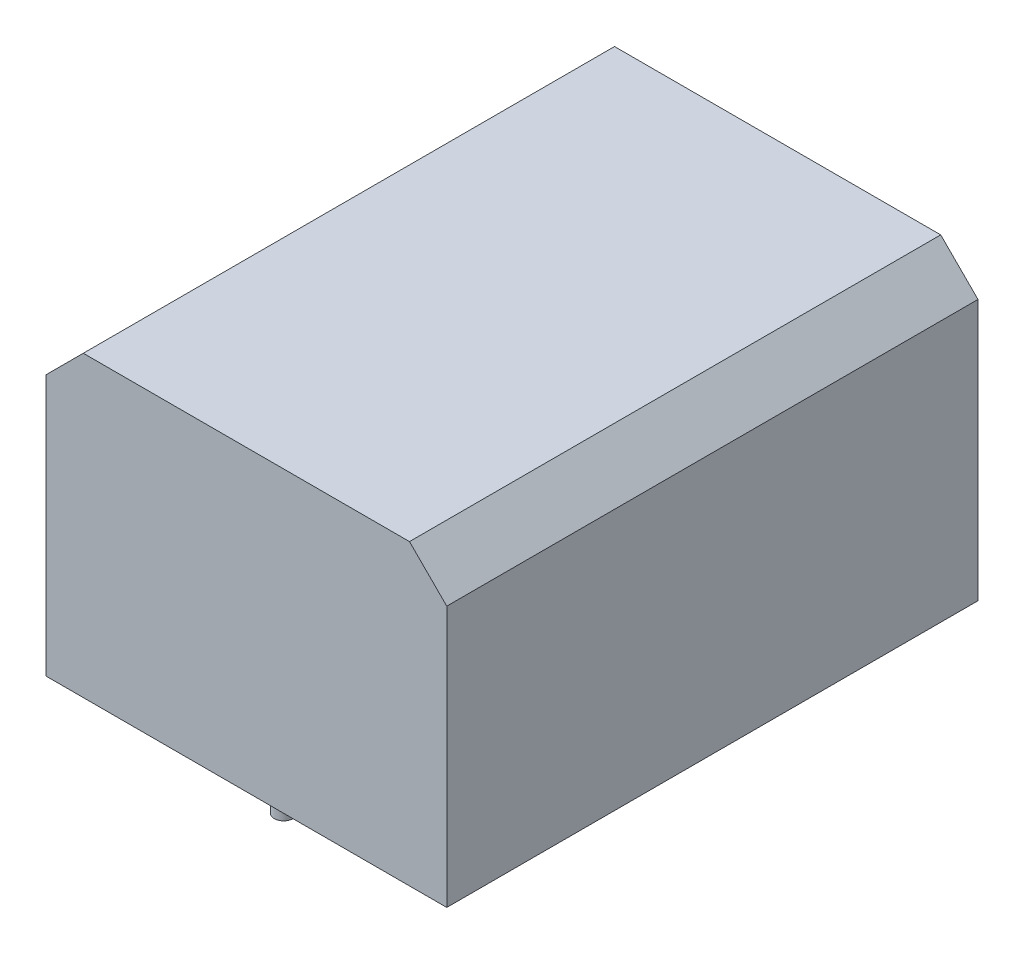
ISO-10303-21;
HEADER;
FILE_DESCRIPTION(('STEP AP214'),'2;1');
FILE_NAME('part.step','',(''),(''),'','','');
FILE_SCHEMA(('AUTOMOTIVE_DESIGN { 1 0 10303 214 1 1 1 1 }'));
ENDSEC;
DATA;
#1=APPLICATION_CONTEXT('core data for automotive mechanical design processes');
#2=APPLICATION_PROTOCOL_DEFINITION('international standard','automotive_design',2000,#1);
#3=PRODUCT_CONTEXT('',#1,'mechanical');
#4=PRODUCT('Part','Part','',(#3));
#5=PRODUCT_RELATED_PRODUCT_CATEGORY('part','',(#4));
#6=PRODUCT_DEFINITION_FORMATION('','',#4);
#7=PRODUCT_DEFINITION_CONTEXT('part definition',#1,'design');
#8=PRODUCT_DEFINITION('design','',#6,#7);
#9=PRODUCT_DEFINITION_SHAPE('','',#8);
#10=(LENGTH_UNIT() NAMED_UNIT(*) SI_UNIT(.MILLI.,.METRE.));
#11=(NAMED_UNIT(*) PLANE_ANGLE_UNIT() SI_UNIT($,.RADIAN.));
#12=(NAMED_UNIT(*) SI_UNIT($,.STERADIAN.) SOLID_ANGLE_UNIT());
#13=UNCERTAINTY_MEASURE_WITH_UNIT(LENGTH_MEASURE(1.E-05),#10,'distance_accuracy_value','');
#14=(GEOMETRIC_REPRESENTATION_CONTEXT(3) GLOBAL_UNCERTAINTY_ASSIGNED_CONTEXT((#13)) GLOBAL_UNIT_ASSIGNED_CONTEXT((#10,
#11,#12)) REPRESENTATION_CONTEXT('',''));
#15=CARTESIAN_POINT('',(0.,0.,0.));
#16=DIRECTION('',(0.,0.,1.));
#17=DIRECTION('',(1.,0.,0.));
#18=AXIS2_PLACEMENT_3D('',#15,#16,#17);
#19=CARTESIAN_POINT('',(-10.75,14.,14.25));
#20=DIRECTION('',(1.,0.,0.));
#21=DIRECTION('',(0.,1.,0.));
#22=AXIS2_PLACEMENT_3D('',#19,#20,#21);
#23=PLANE('',#22);
#24=DIRECTION('',(0.,-1.,0.));
#25=VECTOR('',#24,1.);
#26=CARTESIAN_POINT('',(-10.75,14.,-14.25));
#27=LINE('',#26,#25);
#28=CARTESIAN_POINT('',(-10.75,14.,-14.25));
#29=VERTEX_POINT('',#28);
#30=CARTESIAN_POINT('',(-10.75,0.,-14.25));
#31=VERTEX_POINT('',#30);
#32=EDGE_CURVE('E133',#29,#31,#27,.T.);
#33=ORIENTED_EDGE('',*,*,#32,.T.);
#34=DIRECTION('',(0.,0.,-1.));
#35=VECTOR('',#34,1.);
#36=CARTESIAN_POINT('',(-10.75,0.,14.25));
#37=LINE('',#36,#35);
#38=CARTESIAN_POINT('',(-10.75,0.,14.25));
#39=VERTEX_POINT('',#38);
#40=EDGE_CURVE('E160',#39,#31,#37,.T.);
#41=ORIENTED_EDGE('',*,*,#40,.F.);
#42=DIRECTION('',(0.,-1.,0.));
#43=VECTOR('',#42,1.);
#44=CARTESIAN_POINT('',(-10.75,14.,14.25));
#45=LINE('',#44,#43);
#46=CARTESIAN_POINT('',(-10.75,14.,14.25));
#47=VERTEX_POINT('',#46);
#48=EDGE_CURVE('E149',#47,#39,#45,.T.);
#49=ORIENTED_EDGE('',*,*,#48,.F.);
#50=DIRECTION('',(0.,0.,-1.));
#51=VECTOR('',#50,1.);
#52=CARTESIAN_POINT('',(-10.75,14.,14.25));
#53=LINE('',#52,#51);
#54=EDGE_CURVE('E129',#47,#29,#53,.T.);
#55=ORIENTED_EDGE('',*,*,#54,.T.);
#56=EDGE_LOOP('',(#33,#41,#49,#55));
#57=FACE_BOUND('',#56,.T.);
#58=ADVANCED_FACE('F41',(#57),#23,.F.);
#59=CARTESIAN_POINT('',(-10.75,0.,14.25));
#60=DIRECTION('',(0.,1.,0.));
#61=DIRECTION('',(0.,0.,1.));
#62=AXIS2_PLACEMENT_3D('',#59,#60,#61);
#63=PLANE('',#62);
#64=CARTESIAN_POINT('',(0.,0.,-12.25));
#65=DIRECTION('',(0.,1.,0.));
#66=DIRECTION('',(0.,0.,1.));
#67=AXIS2_PLACEMENT_3D('',#64,#65,#66);
#68=CIRCLE('',#67,0.5);
#69=CARTESIAN_POINT('',(0.,0.,-11.75));
#70=VERTEX_POINT('',#69);
#71=EDGE_CURVE('E11',#70,#70,#68,.F.);
#72=ORIENTED_EDGE('',*,*,#71,.F.);
#73=EDGE_LOOP('',(#72));
#74=FACE_BOUND('',#73,.T.);
#75=CARTESIAN_POINT('',(0.,0.,12.25));
#76=DIRECTION('',(0.,1.,0.));
#77=DIRECTION('',(0.,0.,1.));
#78=AXIS2_PLACEMENT_3D('',#75,#76,#77);
#79=CIRCLE('',#78,0.5);
#80=CARTESIAN_POINT('',(0.,0.,12.75));
#81=VERTEX_POINT('',#80);
#82=EDGE_CURVE('E50',#81,#81,#79,.F.);
#83=ORIENTED_EDGE('',*,*,#82,.F.);
#84=EDGE_LOOP('',(#83));
#85=FACE_BOUND('',#84,.T.);
#86=DIRECTION('',(1.,0.,0.));
#87=VECTOR('',#86,1.);
#88=CARTESIAN_POINT('',(-10.75,0.,-14.25));
#89=LINE('',#88,#87);
#90=CARTESIAN_POINT('',(10.75,0.,-14.25));
#91=VERTEX_POINT('',#90);
#92=EDGE_CURVE('E137',#31,#91,#89,.T.);
#93=ORIENTED_EDGE('',*,*,#92,.T.);
#94=DIRECTION('',(0.,0.,-1.));
#95=VECTOR('',#94,1.);
#96=CARTESIAN_POINT('',(10.75,0.,14.25));
#97=LINE('',#96,#95);
#98=CARTESIAN_POINT('',(10.75,0.,14.25));
#99=VERTEX_POINT('',#98);
#100=EDGE_CURVE('E156',#99,#91,#97,.T.);
#101=ORIENTED_EDGE('',*,*,#100,.F.);
#102=DIRECTION('',(1.,0.,0.));
#103=VECTOR('',#102,1.);
#104=CARTESIAN_POINT('',(-10.75,0.,14.25));
#105=LINE('',#104,#103);
#106=EDGE_CURVE('E96',#39,#99,#105,.T.);
#107=ORIENTED_EDGE('',*,*,#106,.F.);
#108=ORIENTED_EDGE('',*,*,#40,.T.);
#109=EDGE_LOOP('',(#93,#101,#107,#108));
#110=FACE_BOUND('',#109,.T.);
#111=ADVANCED_FACE('F170',(#74,#85,#110),#63,.F.);
#112=CARTESIAN_POINT('',(10.75,0.,14.25));
#113=DIRECTION('',(-1.,0.,0.));
#114=DIRECTION('',(0.,0.,1.));
#115=AXIS2_PLACEMENT_3D('',#112,#113,#114);
#116=PLANE('',#115);
#117=DIRECTION('',(0.,1.,0.));
#118=VECTOR('',#117,1.);
#119=CARTESIAN_POINT('',(10.75,0.,-14.25));
#120=LINE('',#119,#118);
#121=CARTESIAN_POINT('',(10.75,14.,-14.25));
#122=VERTEX_POINT('',#121);
#123=EDGE_CURVE('E140',#91,#122,#120,.T.);
#124=ORIENTED_EDGE('',*,*,#123,.T.);
#125=DIRECTION('',(0.,0.,-1.));
#126=VECTOR('',#125,1.);
#127=CARTESIAN_POINT('',(10.75,14.,14.25));
#128=LINE('',#127,#126);
#129=CARTESIAN_POINT('',(10.75,14.,14.25));
#130=VERTEX_POINT('',#129);
#131=EDGE_CURVE('E120',#130,#122,#128,.T.);
#132=ORIENTED_EDGE('',*,*,#131,.F.);
#133=DIRECTION('',(0.,1.,0.));
#134=VECTOR('',#133,1.);
#135=CARTESIAN_POINT('',(10.75,0.,14.25));
#136=LINE('',#135,#134);
#137=EDGE_CURVE('E109',#99,#130,#136,.T.);
#138=ORIENTED_EDGE('',*,*,#137,.F.);
#139=ORIENTED_EDGE('',*,*,#100,.T.);
#140=EDGE_LOOP('',(#124,#132,#138,#139));
#141=FACE_BOUND('',#140,.T.);
#142=ADVANCED_FACE('F172',(#141),#116,.F.);
#143=CARTESIAN_POINT('',(10.75,14.,14.25));
#144=DIRECTION('',(-0.707106781186547,-0.707106781186547,0.));
#145=DIRECTION('',(0.707106781186548,-0.707106781186548,0.));
#146=AXIS2_PLACEMENT_3D('',#143,#144,#145);
#147=PLANE('',#146);
#148=DIRECTION('',(-0.707106781186548,0.707106781186548,0.));
#149=VECTOR('',#148,1.);
#150=CARTESIAN_POINT('',(10.75,14.,-14.25));
#151=LINE('',#150,#149);
#152=CARTESIAN_POINT('',(8.75,16.,-14.25));
#153=VERTEX_POINT('',#152);
#154=EDGE_CURVE('E118',#122,#153,#151,.T.);
#155=ORIENTED_EDGE('',*,*,#154,.T.);
#156=DIRECTION('',(0.,0.,-1.));
#157=VECTOR('',#156,1.);
#158=CARTESIAN_POINT('',(8.75,16.,14.25));
#159=LINE('',#158,#157);
#160=CARTESIAN_POINT('',(8.75,16.,14.25));
#161=VERTEX_POINT('',#160);
#162=EDGE_CURVE('E115',#161,#153,#159,.T.);
#163=ORIENTED_EDGE('',*,*,#162,.F.);
#164=DIRECTION('',(-0.707106781186548,0.707106781186548,0.));
#165=VECTOR('',#164,1.);
#166=CARTESIAN_POINT('',(10.75,14.,14.25));
#167=LINE('',#166,#165);
#168=EDGE_CURVE('E103',#130,#161,#167,.T.);
#169=ORIENTED_EDGE('',*,*,#168,.F.);
#170=ORIENTED_EDGE('',*,*,#131,.T.);
#171=EDGE_LOOP('',(#155,#163,#169,#170));
#172=FACE_BOUND('',#171,.T.);
#173=ADVANCED_FACE('F116',(#172),#147,.F.);
#174=CARTESIAN_POINT('',(8.75,16.,14.25));
#175=DIRECTION('',(0.,-1.,0.));
#176=DIRECTION('',(1.,0.,0.));
#177=AXIS2_PLACEMENT_3D('',#174,#175,#176);
#178=PLANE('',#177);
#179=DIRECTION('',(-1.,0.,0.));
#180=VECTOR('',#179,1.);
#181=CARTESIAN_POINT('',(8.75,16.,-14.25));
#182=LINE('',#181,#180);
#183=CARTESIAN_POINT('',(-8.75,16.,-14.25));
#184=VERTEX_POINT('',#183);
#185=EDGE_CURVE('E81',#153,#184,#182,.T.);
#186=ORIENTED_EDGE('',*,*,#185,.T.);
#187=DIRECTION('',(0.,0.,-1.));
#188=VECTOR('',#187,1.);
#189=CARTESIAN_POINT('',(-8.75,16.,14.25));
#190=LINE('',#189,#188);
#191=CARTESIAN_POINT('',(-8.75,16.,14.25));
#192=VERTEX_POINT('',#191);
#193=EDGE_CURVE('E121',#192,#184,#190,.T.);
#194=ORIENTED_EDGE('',*,*,#193,.F.);
#195=DIRECTION('',(-1.,0.,0.));
#196=VECTOR('',#195,1.);
#197=CARTESIAN_POINT('',(8.75,16.,14.25));
#198=LINE('',#197,#196);
#199=EDGE_CURVE('E107',#161,#192,#198,.T.);
#200=ORIENTED_EDGE('',*,*,#199,.F.);
#201=ORIENTED_EDGE('',*,*,#162,.T.);
#202=EDGE_LOOP('',(#186,#194,#200,#201));
#203=FACE_BOUND('',#202,.T.);
#204=ADVANCED_FACE('F123',(#203),#178,.F.);
#205=CARTESIAN_POINT('',(-8.75,16.,14.25));
#206=DIRECTION('',(0.707106781186546,-0.707106781186548,0.));
#207=DIRECTION('',(0.707106781186548,0.707106781186547,0.));
#208=AXIS2_PLACEMENT_3D('',#205,#206,#207);
#209=PLANE('',#208);
#210=DIRECTION('',(-0.707106781186548,-0.707106781186547,0.));
#211=VECTOR('',#210,1.);
#212=CARTESIAN_POINT('',(-8.75,16.,-14.25));
#213=LINE('',#212,#211);
#214=EDGE_CURVE('E87',#184,#29,#213,.T.);
#215=ORIENTED_EDGE('',*,*,#214,.T.);
#216=ORIENTED_EDGE('',*,*,#54,.F.);
#217=DIRECTION('',(-0.707106781186548,-0.707106781186547,0.));
#218=VECTOR('',#217,1.);
#219=CARTESIAN_POINT('',(-8.75,16.,14.25));
#220=LINE('',#219,#218);
#221=EDGE_CURVE('E58',#192,#47,#220,.T.);
#222=ORIENTED_EDGE('',*,*,#221,.F.);
#223=ORIENTED_EDGE('',*,*,#193,.T.);
#224=EDGE_LOOP('',(#215,#216,#222,#223));
#225=FACE_BOUND('',#224,.T.);
#226=ADVANCED_FACE('F182',(#225),#209,.F.);
#227=CARTESIAN_POINT('',(0.,0.,14.25));
#228=DIRECTION('',(0.,0.,1.));
#229=DIRECTION('',(1.,0.,0.));
#230=AXIS2_PLACEMENT_3D('',#227,#228,#229);
#231=PLANE('',#230);
#232=ORIENTED_EDGE('',*,*,#48,.T.);
#233=ORIENTED_EDGE('',*,*,#106,.T.);
#234=ORIENTED_EDGE('',*,*,#137,.T.);
#235=ORIENTED_EDGE('',*,*,#168,.T.);
#236=ORIENTED_EDGE('',*,*,#199,.T.);
#237=ORIENTED_EDGE('',*,*,#221,.T.);
#238=EDGE_LOOP('',(#232,#233,#234,#235,#236,#237));
#239=FACE_BOUND('',#238,.T.);
#240=ADVANCED_FACE('F105',(#239),#231,.T.);
#241=CARTESIAN_POINT('',(0.,0.,-14.25));
#242=DIRECTION('',(0.,0.,1.));
#243=DIRECTION('',(1.,0.,0.));
#244=AXIS2_PLACEMENT_3D('',#241,#242,#243);
#245=PLANE('',#244);
#246=ORIENTED_EDGE('',*,*,#32,.F.);
#247=ORIENTED_EDGE('',*,*,#214,.F.);
#248=ORIENTED_EDGE('',*,*,#185,.F.);
#249=ORIENTED_EDGE('',*,*,#154,.F.);
#250=ORIENTED_EDGE('',*,*,#123,.F.);
#251=ORIENTED_EDGE('',*,*,#92,.F.);
#252=EDGE_LOOP('',(#246,#247,#248,#249,#250,#251));
#253=FACE_BOUND('',#252,.T.);
#254=ADVANCED_FACE('F179',(#253),#245,.F.);
#255=CARTESIAN_POINT('',(0.,-2.,12.25));
#256=DIRECTION('',(0.,1.,0.));
#257=DIRECTION('',(0.,0.,1.));
#258=AXIS2_PLACEMENT_3D('',#255,#256,#257);
#259=CYLINDRICAL_SURFACE('',#258,0.5);
#260=CARTESIAN_POINT('',(0.,-2.,12.25));
#261=DIRECTION('',(0.,-1.,0.));
#262=DIRECTION('',(0.,0.,-1.));
#263=AXIS2_PLACEMENT_3D('',#260,#261,#262);
#264=CIRCLE('',#263,0.5);
#265=CARTESIAN_POINT('',(0.,-2.,11.75));
#266=VERTEX_POINT('',#265);
#267=EDGE_CURVE('E138',#266,#266,#264,.T.);
#268=ORIENTED_EDGE('',*,*,#267,.F.);
#269=EDGE_LOOP('',(#268));
#270=FACE_BOUND('',#269,.T.);
#271=ORIENTED_EDGE('',*,*,#82,.T.);
#272=EDGE_LOOP('',(#271));
#273=FACE_BOUND('',#272,.T.);
#274=ADVANCED_FACE('F168',(#270,#273),#259,.T.);
#275=CARTESIAN_POINT('',(0.,-2.,12.25));
#276=DIRECTION('',(0.,-1.,0.));
#277=DIRECTION('',(0.,0.,-1.));
#278=AXIS2_PLACEMENT_3D('',#275,#276,#277);
#279=PLANE('',#278);
#280=ORIENTED_EDGE('',*,*,#267,.T.);
#281=EDGE_LOOP('',(#280));
#282=FACE_BOUND('',#281,.T.);
#283=ADVANCED_FACE('F232',(#282),#279,.T.);
#284=CARTESIAN_POINT('',(0.,-2.,-12.25));
#285=DIRECTION('',(0.,1.,0.));
#286=DIRECTION('',(0.,0.,1.));
#287=AXIS2_PLACEMENT_3D('',#284,#285,#286);
#288=CYLINDRICAL_SURFACE('',#287,0.5);
#289=CARTESIAN_POINT('',(0.,-2.,-12.25));
#290=DIRECTION('',(0.,-1.,0.));
#291=DIRECTION('',(0.,0.,-1.));
#292=AXIS2_PLACEMENT_3D('',#289,#290,#291);
#293=CIRCLE('',#292,0.5);
#294=CARTESIAN_POINT('',(0.,-2.,-12.75));
#295=VERTEX_POINT('',#294);
#296=EDGE_CURVE('E297',#295,#295,#293,.T.);
#297=ORIENTED_EDGE('',*,*,#296,.F.);
#298=EDGE_LOOP('',(#297));
#299=FACE_BOUND('',#298,.T.);
#300=ORIENTED_EDGE('',*,*,#71,.T.);
#301=EDGE_LOOP('',(#300));
#302=FACE_BOUND('',#301,.T.);
#303=ADVANCED_FACE('F241',(#299,#302),#288,.T.);
#304=CARTESIAN_POINT('',(0.,-2.,-12.25));
#305=DIRECTION('',(0.,-1.,0.));
#306=DIRECTION('',(0.,0.,-1.));
#307=AXIS2_PLACEMENT_3D('',#304,#305,#306);
#308=PLANE('',#307);
#309=ORIENTED_EDGE('',*,*,#296,.T.);
#310=EDGE_LOOP('',(#309));
#311=FACE_BOUND('',#310,.T.);
#312=ADVANCED_FACE('F250',(#311),#308,.T.);
#313=CLOSED_SHELL('',(#58,#111,#142,#173,#204,#226,#240,#254,#274,#283,#303,#312));
#314=MANIFOLD_SOLID_BREP('B2',#313);
#315=ADVANCED_BREP_SHAPE_REPRESENTATION('',(#18,#314),#14);
#316=SHAPE_DEFINITION_REPRESENTATION(#9,#315);
ENDSEC;
END-ISO-10303-21;
